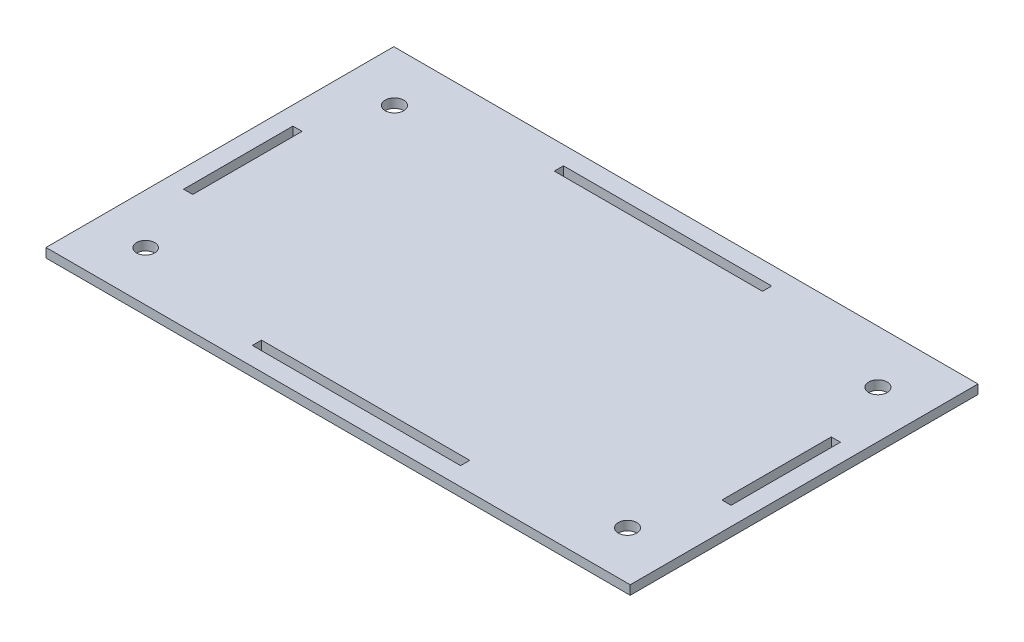
ISO-10303-21;
HEADER;
FILE_DESCRIPTION(('STEP AP214'),'2;1');
FILE_NAME('part.step','',(''),(''),'','','');
FILE_SCHEMA(('AUTOMOTIVE_DESIGN { 1 0 10303 214 1 1 1 1 }'));
ENDSEC;
DATA;
#1=APPLICATION_CONTEXT('core data for automotive mechanical design processes');
#2=APPLICATION_PROTOCOL_DEFINITION('international standard','automotive_design',2000,#1);
#3=PRODUCT_CONTEXT('',#1,'mechanical');
#4=PRODUCT('Part','Part','',(#3));
#5=PRODUCT_RELATED_PRODUCT_CATEGORY('part','',(#4));
#6=PRODUCT_DEFINITION_FORMATION('','',#4);
#7=PRODUCT_DEFINITION_CONTEXT('part definition',#1,'design');
#8=PRODUCT_DEFINITION('design','',#6,#7);
#9=PRODUCT_DEFINITION_SHAPE('','',#8);
#10=(LENGTH_UNIT() NAMED_UNIT(*) SI_UNIT(.MILLI.,.METRE.));
#11=(NAMED_UNIT(*) PLANE_ANGLE_UNIT() SI_UNIT($,.RADIAN.));
#12=(NAMED_UNIT(*) SI_UNIT($,.STERADIAN.) SOLID_ANGLE_UNIT());
#13=UNCERTAINTY_MEASURE_WITH_UNIT(LENGTH_MEASURE(1.E-05),#10,'distance_accuracy_value','');
#14=(GEOMETRIC_REPRESENTATION_CONTEXT(3) GLOBAL_UNCERTAINTY_ASSIGNED_CONTEXT((#13)) GLOBAL_UNIT_ASSIGNED_CONTEXT((#10,
#11,#12)) REPRESENTATION_CONTEXT('',''));
#15=CARTESIAN_POINT('',(0.,0.,0.));
#16=DIRECTION('',(0.,0.,1.));
#17=DIRECTION('',(1.,0.,0.));
#18=AXIS2_PLACEMENT_3D('',#15,#16,#17);
#19=CARTESIAN_POINT('',(0.,2.,0.));
#20=DIRECTION('',(0.,1.,0.));
#21=DIRECTION('',(0.,0.,1.));
#22=AXIS2_PLACEMENT_3D('',#19,#20,#21);
#23=PLANE('',#22);
#24=CARTESIAN_POINT('',(3.69534668895955,2.,-3.58517685274402));
#25=DIRECTION('',(0.,1.,0.));
#26=DIRECTION('',(0.,0.,1.));
#27=AXIS2_PLACEMENT_3D('',#24,#25,#26);
#28=CIRCLE('',#27,1.97543439169033);
#29=CARTESIAN_POINT('',(3.69534668895955,2.,-1.60974246105369));
#30=VERTEX_POINT('',#29);
#31=EDGE_CURVE('E642',#30,#30,#28,.T.);
#32=ORIENTED_EDGE('',*,*,#31,.F.);
#33=EDGE_LOOP('',(#32));
#34=FACE_BOUND('',#33,.T.);
#35=CARTESIAN_POINT('',(109.903070513536,2.,-57.085639350411));
#36=DIRECTION('',(0.,1.,0.));
#37=DIRECTION('',(0.,0.,1.));
#38=AXIS2_PLACEMENT_3D('',#35,#36,#37);
#39=CIRCLE('',#38,2.00578430429312);
#40=CARTESIAN_POINT('',(109.903070513536,2.,-55.0798550461179));
#41=VERTEX_POINT('',#40);
#42=EDGE_CURVE('E212',#41,#41,#39,.T.);
#43=ORIENTED_EDGE('',*,*,#42,.F.);
#44=EDGE_LOOP('',(#43));
#45=FACE_BOUND('',#44,.T.);
#46=DIRECTION('',(0.,0.,-1.));
#47=VECTOR('',#46,1.);
#48=CARTESIAN_POINT('',(120.186543169698,2.,7.22187722593417));
#49=LINE('',#48,#47);
#50=CARTESIAN_POINT('',(120.186543169698,2.,7.22187722593417));
#51=VERTEX_POINT('',#50);
#52=CARTESIAN_POINT('',(120.186543169698,2.,-68.6261227740658));
#53=VERTEX_POINT('',#52);
#54=EDGE_CURVE('E357',#51,#53,#49,.T.);
#55=ORIENTED_EDGE('',*,*,#54,.T.);
#56=DIRECTION('',(-1.,0.,0.));
#57=VECTOR('',#56,1.);
#58=CARTESIAN_POINT('',(120.186543169698,2.,-68.6261227740658));
#59=LINE('',#58,#57);
#60=CARTESIAN_POINT('',(-7.22345683030152,2.,-68.6261227740658));
#61=VERTEX_POINT('',#60);
#62=EDGE_CURVE('E361',#53,#61,#59,.T.);
#63=ORIENTED_EDGE('',*,*,#62,.T.);
#64=DIRECTION('',(0.,0.,1.));
#65=VECTOR('',#64,1.);
#66=CARTESIAN_POINT('',(-7.22345683030153,2.,7.22187722593419));
#67=LINE('',#66,#65);
#68=CARTESIAN_POINT('',(-7.22345683030153,2.,7.22187722593419));
#69=VERTEX_POINT('',#68);
#70=EDGE_CURVE('E365',#61,#69,#67,.T.);
#71=ORIENTED_EDGE('',*,*,#70,.T.);
#72=DIRECTION('',(1.,0.,0.));
#73=VECTOR('',#72,1.);
#74=CARTESIAN_POINT('',(120.186543169698,2.,7.22187722593417));
#75=LINE('',#74,#73);
#76=EDGE_CURVE('E368',#69,#51,#75,.T.);
#77=ORIENTED_EDGE('',*,*,#76,.T.);
#78=EDGE_LOOP('',(#55,#63,#71,#77));
#79=FACE_BOUND('',#78,.T.);
#80=DIRECTION('',(-1.,0.,0.));
#81=VECTOR('',#80,1.);
#82=CARTESIAN_POINT('',(-1.22345683030151,2.,-42.6261227740658));
#83=LINE('',#82,#81);
#84=CARTESIAN_POINT('',(-1.22345683030151,2.,-42.6261227740658));
#85=VERTEX_POINT('',#84);
#86=CARTESIAN_POINT('',(-3.22345683030152,2.,-42.6261227740658));
#87=VERTEX_POINT('',#86);
#88=EDGE_CURVE('E317',#85,#87,#83,.T.);
#89=ORIENTED_EDGE('',*,*,#88,.F.);
#90=DIRECTION('',(0.,0.,-1.));
#91=VECTOR('',#90,1.);
#92=CARTESIAN_POINT('',(-1.22345683030151,2.,-42.6261227740658));
#93=LINE('',#92,#91);
#94=CARTESIAN_POINT('',(-1.22345683030151,2.,-18.7781227740658));
#95=VERTEX_POINT('',#94);
#96=EDGE_CURVE('E314',#95,#85,#93,.T.);
#97=ORIENTED_EDGE('',*,*,#96,.F.);
#98=DIRECTION('',(1.,0.,0.));
#99=VECTOR('',#98,1.);
#100=CARTESIAN_POINT('',(-1.22345683030151,2.,-18.7781227740658));
#101=LINE('',#100,#99);
#102=CARTESIAN_POINT('',(-3.22345683030152,2.,-18.7781227740658));
#103=VERTEX_POINT('',#102);
#104=EDGE_CURVE('E325',#103,#95,#101,.T.);
#105=ORIENTED_EDGE('',*,*,#104,.F.);
#106=DIRECTION('',(0.,0.,1.));
#107=VECTOR('',#106,1.);
#108=CARTESIAN_POINT('',(-3.22345683030152,2.,-42.6261227740658));
#109=LINE('',#108,#107);
#110=EDGE_CURVE('E321',#87,#103,#109,.T.);
#111=ORIENTED_EDGE('',*,*,#110,.F.);
#112=EDGE_LOOP('',(#89,#97,#105,#111));
#113=FACE_BOUND('',#112,.T.);
#114=DIRECTION('',(1.,0.,0.));
#115=VECTOR('',#114,1.);
#116=CARTESIAN_POINT('',(33.7765431696985,2.,-62.6261227740658));
#117=LINE('',#116,#115);
#118=CARTESIAN_POINT('',(33.7765431696985,2.,-62.6261227740658));
#119=VERTEX_POINT('',#118);
#120=CARTESIAN_POINT('',(79.1865431696985,2.,-62.6261227740658));
#121=VERTEX_POINT('',#120);
#122=EDGE_CURVE('E274',#119,#121,#117,.T.);
#123=ORIENTED_EDGE('',*,*,#122,.F.);
#124=DIRECTION('',(0.,0.,1.));
#125=VECTOR('',#124,1.);
#126=CARTESIAN_POINT('',(33.7765431696985,2.,-62.6261227740658));
#127=LINE('',#126,#125);
#128=CARTESIAN_POINT('',(33.7765431696985,2.,-64.6261227740658));
#129=VERTEX_POINT('',#128);
#130=EDGE_CURVE('E271',#129,#119,#127,.T.);
#131=ORIENTED_EDGE('',*,*,#130,.F.);
#132=DIRECTION('',(-1.,0.,0.));
#133=VECTOR('',#132,1.);
#134=CARTESIAN_POINT('',(33.7765431696985,2.,-64.6261227740658));
#135=LINE('',#134,#133);
#136=CARTESIAN_POINT('',(79.1865431696985,2.,-64.6261227740658));
#137=VERTEX_POINT('',#136);
#138=EDGE_CURVE('E282',#137,#129,#135,.T.);
#139=ORIENTED_EDGE('',*,*,#138,.F.);
#140=DIRECTION('',(0.,0.,-1.));
#141=VECTOR('',#140,1.);
#142=CARTESIAN_POINT('',(79.1865431696985,2.,-62.6261227740658));
#143=LINE('',#142,#141);
#144=EDGE_CURVE('E278',#121,#137,#143,.T.);
#145=ORIENTED_EDGE('',*,*,#144,.F.);
#146=EDGE_LOOP('',(#123,#131,#139,#145));
#147=FACE_BOUND('',#146,.T.);
#148=DIRECTION('',(1.,0.,0.));
#149=VECTOR('',#148,1.);
#150=CARTESIAN_POINT('',(114.186543169698,2.,-18.7781227740658));
#151=LINE('',#150,#149);
#152=CARTESIAN_POINT('',(114.186543169698,2.,-18.7781227740658));
#153=VERTEX_POINT('',#152);
#154=CARTESIAN_POINT('',(116.186543169698,2.,-18.7781227740658));
#155=VERTEX_POINT('',#154);
#156=EDGE_CURVE('E231',#153,#155,#151,.T.);
#157=ORIENTED_EDGE('',*,*,#156,.F.);
#158=DIRECTION('',(0.,0.,1.));
#159=VECTOR('',#158,1.);
#160=CARTESIAN_POINT('',(114.186543169698,2.,-42.6261227740658));
#161=LINE('',#160,#159);
#162=CARTESIAN_POINT('',(114.186543169698,2.,-42.6261227740658));
#163=VERTEX_POINT('',#162);
#164=EDGE_CURVE('E228',#163,#153,#161,.T.);
#165=ORIENTED_EDGE('',*,*,#164,.F.);
#166=DIRECTION('',(-1.,0.,0.));
#167=VECTOR('',#166,1.);
#168=CARTESIAN_POINT('',(114.186543169698,2.,-42.6261227740658));
#169=LINE('',#168,#167);
#170=CARTESIAN_POINT('',(116.186543169698,2.,-42.6261227740658));
#171=VERTEX_POINT('',#170);
#172=EDGE_CURVE('E239',#171,#163,#169,.T.);
#173=ORIENTED_EDGE('',*,*,#172,.F.);
#174=DIRECTION('',(0.,0.,-1.));
#175=VECTOR('',#174,1.);
#176=CARTESIAN_POINT('',(116.186543169698,2.,-42.6261227740658));
#177=LINE('',#176,#175);
#178=EDGE_CURVE('E235',#155,#171,#177,.T.);
#179=ORIENTED_EDGE('',*,*,#178,.F.);
#180=EDGE_LOOP('',(#157,#165,#173,#179));
#181=FACE_BOUND('',#180,.T.);
#182=DIRECTION('',(-1.,0.,0.));
#183=VECTOR('',#182,1.);
#184=CARTESIAN_POINT('',(79.1865431696985,2.,1.22187722593417));
#185=LINE('',#184,#183);
#186=CARTESIAN_POINT('',(79.1865431696985,2.,1.22187722593417));
#187=VERTEX_POINT('',#186);
#188=CARTESIAN_POINT('',(33.7765431696985,2.,1.22187722593417));
#189=VERTEX_POINT('',#188);
#190=EDGE_CURVE('E186',#187,#189,#185,.T.);
#191=ORIENTED_EDGE('',*,*,#190,.F.);
#192=DIRECTION('',(0.,0.,-1.));
#193=VECTOR('',#192,1.);
#194=CARTESIAN_POINT('',(79.1865431696985,2.,1.22187722593417));
#195=LINE('',#194,#193);
#196=CARTESIAN_POINT('',(79.1865431696985,2.,3.22187722593417));
#197=VERTEX_POINT('',#196);
#198=EDGE_CURVE('E177',#197,#187,#195,.T.);
#199=ORIENTED_EDGE('',*,*,#198,.F.);
#200=DIRECTION('',(1.,0.,0.));
#201=VECTOR('',#200,1.);
#202=CARTESIAN_POINT('',(79.1865431696985,2.,3.22187722593417));
#203=LINE('',#202,#201);
#204=CARTESIAN_POINT('',(33.7765431696985,2.,3.22187722593417));
#205=VERTEX_POINT('',#204);
#206=EDGE_CURVE('E204',#205,#197,#203,.T.);
#207=ORIENTED_EDGE('',*,*,#206,.F.);
#208=DIRECTION('',(0.,0.,1.));
#209=VECTOR('',#208,1.);
#210=CARTESIAN_POINT('',(33.7765431696985,2.,1.22187722593417));
#211=LINE('',#210,#209);
#212=EDGE_CURVE('E200',#189,#205,#211,.T.);
#213=ORIENTED_EDGE('',*,*,#212,.F.);
#214=EDGE_LOOP('',(#191,#199,#207,#213));
#215=FACE_BOUND('',#214,.T.);
#216=CARTESIAN_POINT('',(109.140500171472,2.,-3.23821550651677));
#217=DIRECTION('',(0.,1.,0.));
#218=DIRECTION('',(0.,0.,1.));
#219=AXIS2_PLACEMENT_3D('',#216,#217,#218);
#220=CIRCLE('',#219,2.00764752498284);
#221=CARTESIAN_POINT('',(109.140500171472,2.,-1.23056798153392));
#222=VERTEX_POINT('',#221);
#223=EDGE_CURVE('E650',#222,#222,#220,.T.);
#224=ORIENTED_EDGE('',*,*,#223,.F.);
#225=EDGE_LOOP('',(#224));
#226=FACE_BOUND('',#225,.T.);
#227=CARTESIAN_POINT('',(3.94520992792013,2.,-57.6065574065732));
#228=DIRECTION('',(0.,1.,0.));
#229=DIRECTION('',(0.,0.,1.));
#230=AXIS2_PLACEMENT_3D('',#227,#228,#229);
#231=CIRCLE('',#230,2.02059865968082);
#232=CARTESIAN_POINT('',(3.94520992792013,2.,-55.5859587468924));
#233=VERTEX_POINT('',#232);
#234=EDGE_CURVE('E631',#233,#233,#231,.T.);
#235=ORIENTED_EDGE('',*,*,#234,.F.);
#236=EDGE_LOOP('',(#235));
#237=FACE_BOUND('',#236,.T.);
#238=ADVANCED_FACE('F39',(#34,#45,#79,#113,#147,#181,#215,#226,#237),#23,.T.);
#239=CARTESIAN_POINT('',(0.,0.,0.));
#240=DIRECTION('',(0.,1.,0.));
#241=DIRECTION('',(0.,0.,1.));
#242=AXIS2_PLACEMENT_3D('',#239,#240,#241);
#243=PLANE('',#242);
#244=DIRECTION('',(0.,0.,1.));
#245=VECTOR('',#244,1.);
#246=CARTESIAN_POINT('',(114.186543169698,0.,-42.6261227740658));
#247=LINE('',#246,#245);
#248=CARTESIAN_POINT('',(114.186543169698,0.,-42.6261227740658));
#249=VERTEX_POINT('',#248);
#250=CARTESIAN_POINT('',(114.186543169698,0.,-18.7781227740658));
#251=VERTEX_POINT('',#250);
#252=EDGE_CURVE('E195',#249,#251,#247,.T.);
#253=ORIENTED_EDGE('',*,*,#252,.T.);
#254=DIRECTION('',(1.,0.,0.));
#255=VECTOR('',#254,1.);
#256=CARTESIAN_POINT('',(114.186543169698,0.,-18.7781227740658));
#257=LINE('',#256,#255);
#258=CARTESIAN_POINT('',(116.186543169698,0.,-18.7781227740658));
#259=VERTEX_POINT('',#258);
#260=EDGE_CURVE('E246',#251,#259,#257,.T.);
#261=ORIENTED_EDGE('',*,*,#260,.T.);
#262=DIRECTION('',(0.,0.,-1.));
#263=VECTOR('',#262,1.);
#264=CARTESIAN_POINT('',(116.186543169698,0.,-42.6261227740658));
#265=LINE('',#264,#263);
#266=CARTESIAN_POINT('',(116.186543169698,0.,-42.6261227740658));
#267=VERTEX_POINT('',#266);
#268=EDGE_CURVE('E250',#259,#267,#265,.T.);
#269=ORIENTED_EDGE('',*,*,#268,.T.);
#270=DIRECTION('',(-1.,0.,0.));
#271=VECTOR('',#270,1.);
#272=CARTESIAN_POINT('',(114.186543169698,0.,-42.6261227740658));
#273=LINE('',#272,#271);
#274=EDGE_CURVE('E232',#267,#249,#273,.T.);
#275=ORIENTED_EDGE('',*,*,#274,.T.);
#276=EDGE_LOOP('',(#253,#261,#269,#275));
#277=FACE_BOUND('',#276,.T.);
#278=DIRECTION('',(0.,0.,-1.));
#279=VECTOR('',#278,1.);
#280=CARTESIAN_POINT('',(-1.22345683030151,0.,-42.6261227740658));
#281=LINE('',#280,#279);
#282=CARTESIAN_POINT('',(-1.22345683030151,0.,-18.7781227740658));
#283=VERTEX_POINT('',#282);
#284=CARTESIAN_POINT('',(-1.22345683030151,0.,-42.6261227740658));
#285=VERTEX_POINT('',#284);
#286=EDGE_CURVE('E313',#283,#285,#281,.T.);
#287=ORIENTED_EDGE('',*,*,#286,.T.);
#288=DIRECTION('',(-1.,0.,0.));
#289=VECTOR('',#288,1.);
#290=CARTESIAN_POINT('',(-1.22345683030151,0.,-42.6261227740658));
#291=LINE('',#290,#289);
#292=CARTESIAN_POINT('',(-3.22345683030152,0.,-42.6261227740658));
#293=VERTEX_POINT('',#292);
#294=EDGE_CURVE('E332',#285,#293,#291,.T.);
#295=ORIENTED_EDGE('',*,*,#294,.T.);
#296=DIRECTION('',(0.,0.,1.));
#297=VECTOR('',#296,1.);
#298=CARTESIAN_POINT('',(-3.22345683030152,0.,-42.6261227740658));
#299=LINE('',#298,#297);
#300=CARTESIAN_POINT('',(-3.22345683030152,0.,-18.7781227740658));
#301=VERTEX_POINT('',#300);
#302=EDGE_CURVE('E336',#293,#301,#299,.T.);
#303=ORIENTED_EDGE('',*,*,#302,.T.);
#304=DIRECTION('',(1.,0.,0.));
#305=VECTOR('',#304,1.);
#306=CARTESIAN_POINT('',(-1.22345683030151,0.,-18.7781227740658));
#307=LINE('',#306,#305);
#308=EDGE_CURVE('E318',#301,#283,#307,.T.);
#309=ORIENTED_EDGE('',*,*,#308,.T.);
#310=EDGE_LOOP('',(#287,#295,#303,#309));
#311=FACE_BOUND('',#310,.T.);
#312=DIRECTION('',(0.,0.,-1.));
#313=VECTOR('',#312,1.);
#314=CARTESIAN_POINT('',(120.186543169698,0.,7.22187722593417));
#315=LINE('',#314,#313);
#316=CARTESIAN_POINT('',(120.186543169698,0.,7.22187722593417));
#317=VERTEX_POINT('',#316);
#318=CARTESIAN_POINT('',(120.186543169698,0.,-68.6261227740658));
#319=VERTEX_POINT('',#318);
#320=EDGE_CURVE('E356',#317,#319,#315,.T.);
#321=ORIENTED_EDGE('',*,*,#320,.F.);
#322=DIRECTION('',(1.,0.,0.));
#323=VECTOR('',#322,1.);
#324=CARTESIAN_POINT('',(120.186543169698,0.,7.22187722593417));
#325=LINE('',#324,#323);
#326=CARTESIAN_POINT('',(-7.22345683030153,0.,7.22187722593419));
#327=VERTEX_POINT('',#326);
#328=EDGE_CURVE('E362',#327,#317,#325,.T.);
#329=ORIENTED_EDGE('',*,*,#328,.F.);
#330=DIRECTION('',(0.,0.,1.));
#331=VECTOR('',#330,1.);
#332=CARTESIAN_POINT('',(-7.22345683030153,0.,7.22187722593419));
#333=LINE('',#332,#331);
#334=CARTESIAN_POINT('',(-7.22345683030152,0.,-68.6261227740658));
#335=VERTEX_POINT('',#334);
#336=EDGE_CURVE('E378',#335,#327,#333,.T.);
#337=ORIENTED_EDGE('',*,*,#336,.F.);
#338=DIRECTION('',(-1.,0.,0.));
#339=VECTOR('',#338,1.);
#340=CARTESIAN_POINT('',(120.186543169698,0.,-68.6261227740658));
#341=LINE('',#340,#339);
#342=EDGE_CURVE('E375',#319,#335,#341,.T.);
#343=ORIENTED_EDGE('',*,*,#342,.F.);
#344=EDGE_LOOP('',(#321,#329,#337,#343));
#345=FACE_BOUND('',#344,.T.);
#346=DIRECTION('',(0.,0.,1.));
#347=VECTOR('',#346,1.);
#348=CARTESIAN_POINT('',(33.7765431696985,0.,-62.6261227740658));
#349=LINE('',#348,#347);
#350=CARTESIAN_POINT('',(33.7765431696985,0.,-64.6261227740658));
#351=VERTEX_POINT('',#350);
#352=CARTESIAN_POINT('',(33.7765431696985,0.,-62.6261227740658));
#353=VERTEX_POINT('',#352);
#354=EDGE_CURVE('E270',#351,#353,#349,.T.);
#355=ORIENTED_EDGE('',*,*,#354,.T.);
#356=DIRECTION('',(1.,0.,0.));
#357=VECTOR('',#356,1.);
#358=CARTESIAN_POINT('',(33.7765431696985,0.,-62.6261227740658));
#359=LINE('',#358,#357);
#360=CARTESIAN_POINT('',(79.1865431696985,0.,-62.6261227740658));
#361=VERTEX_POINT('',#360);
#362=EDGE_CURVE('E289',#353,#361,#359,.T.);
#363=ORIENTED_EDGE('',*,*,#362,.T.);
#364=DIRECTION('',(0.,0.,-1.));
#365=VECTOR('',#364,1.);
#366=CARTESIAN_POINT('',(79.1865431696985,0.,-62.6261227740658));
#367=LINE('',#366,#365);
#368=CARTESIAN_POINT('',(79.1865431696985,0.,-64.6261227740658));
#369=VERTEX_POINT('',#368);
#370=EDGE_CURVE('E293',#361,#369,#367,.T.);
#371=ORIENTED_EDGE('',*,*,#370,.T.);
#372=DIRECTION('',(-1.,0.,0.));
#373=VECTOR('',#372,1.);
#374=CARTESIAN_POINT('',(33.7765431696985,0.,-64.6261227740658));
#375=LINE('',#374,#373);
#376=EDGE_CURVE('E275',#369,#351,#375,.T.);
#377=ORIENTED_EDGE('',*,*,#376,.T.);
#378=EDGE_LOOP('',(#355,#363,#371,#377));
#379=FACE_BOUND('',#378,.T.);
#380=DIRECTION('',(0.,0.,-1.));
#381=VECTOR('',#380,1.);
#382=CARTESIAN_POINT('',(79.1865431696985,0.,1.22187722593417));
#383=LINE('',#382,#381);
#384=CARTESIAN_POINT('',(79.1865431696985,0.,3.22187722593417));
#385=VERTEX_POINT('',#384);
#386=CARTESIAN_POINT('',(79.1865431696985,0.,1.22187722593417));
#387=VERTEX_POINT('',#386);
#388=EDGE_CURVE('E63',#385,#387,#383,.T.);
#389=ORIENTED_EDGE('',*,*,#388,.T.);
#390=DIRECTION('',(-1.,0.,0.));
#391=VECTOR('',#390,1.);
#392=CARTESIAN_POINT('',(79.1865431696985,0.,1.22187722593417));
#393=LINE('',#392,#391);
#394=CARTESIAN_POINT('',(33.7765431696985,0.,1.22187722593417));
#395=VERTEX_POINT('',#394);
#396=EDGE_CURVE('E193',#387,#395,#393,.T.);
#397=ORIENTED_EDGE('',*,*,#396,.T.);
#398=DIRECTION('',(0.,0.,1.));
#399=VECTOR('',#398,1.);
#400=CARTESIAN_POINT('',(33.7765431696985,0.,1.22187722593417));
#401=LINE('',#400,#399);
#402=CARTESIAN_POINT('',(33.7765431696985,0.,3.22187722593417));
#403=VERTEX_POINT('',#402);
#404=EDGE_CURVE('E215',#395,#403,#401,.T.);
#405=ORIENTED_EDGE('',*,*,#404,.T.);
#406=DIRECTION('',(1.,0.,0.));
#407=VECTOR('',#406,1.);
#408=CARTESIAN_POINT('',(79.1865431696985,0.,3.22187722593417));
#409=LINE('',#408,#407);
#410=EDGE_CURVE('E187',#403,#385,#409,.T.);
#411=ORIENTED_EDGE('',*,*,#410,.T.);
#412=EDGE_LOOP('',(#389,#397,#405,#411));
#413=FACE_BOUND('',#412,.T.);
#414=CARTESIAN_POINT('',(109.903070513536,0.,-57.085639350411));
#415=DIRECTION('',(0.,1.,0.));
#416=DIRECTION('',(0.,0.,1.));
#417=AXIS2_PLACEMENT_3D('',#414,#415,#416);
#418=CIRCLE('',#417,2.00578430429312);
#419=CARTESIAN_POINT('',(109.903070513536,0.,-55.0798550461179));
#420=VERTEX_POINT('',#419);
#421=EDGE_CURVE('E654',#420,#420,#418,.T.);
#422=ORIENTED_EDGE('',*,*,#421,.T.);
#423=EDGE_LOOP('',(#422));
#424=FACE_BOUND('',#423,.T.);
#425=CARTESIAN_POINT('',(109.140500171472,0.,-3.23821550651677));
#426=DIRECTION('',(0.,1.,0.));
#427=DIRECTION('',(0.,0.,1.));
#428=AXIS2_PLACEMENT_3D('',#425,#426,#427);
#429=CIRCLE('',#428,2.00764752498284);
#430=CARTESIAN_POINT('',(109.140500171472,0.,-1.23056798153392));
#431=VERTEX_POINT('',#430);
#432=EDGE_CURVE('E646',#431,#431,#429,.T.);
#433=ORIENTED_EDGE('',*,*,#432,.T.);
#434=EDGE_LOOP('',(#433));
#435=FACE_BOUND('',#434,.T.);
#436=CARTESIAN_POINT('',(3.69534668895955,0.,-3.58517685274402));
#437=DIRECTION('',(0.,1.,0.));
#438=DIRECTION('',(0.,0.,1.));
#439=AXIS2_PLACEMENT_3D('',#436,#437,#438);
#440=CIRCLE('',#439,1.97543439169033);
#441=CARTESIAN_POINT('',(3.69534668895955,0.,-1.60974246105369));
#442=VERTEX_POINT('',#441);
#443=EDGE_CURVE('E639',#442,#442,#440,.T.);
#444=ORIENTED_EDGE('',*,*,#443,.T.);
#445=EDGE_LOOP('',(#444));
#446=FACE_BOUND('',#445,.T.);
#447=CARTESIAN_POINT('',(3.94520992792013,0.,-57.6065574065732));
#448=DIRECTION('',(0.,1.,0.));
#449=DIRECTION('',(0.,0.,1.));
#450=AXIS2_PLACEMENT_3D('',#447,#448,#449);
#451=CIRCLE('',#450,2.02059865968082);
#452=CARTESIAN_POINT('',(3.94520992792013,0.,-55.5859587468924));
#453=VERTEX_POINT('',#452);
#454=EDGE_CURVE('E634',#453,#453,#451,.T.);
#455=ORIENTED_EDGE('',*,*,#454,.T.);
#456=EDGE_LOOP('',(#455));
#457=FACE_BOUND('',#456,.T.);
#458=ADVANCED_FACE('F401',(#277,#311,#345,#379,#413,#424,#435,#446,#457),#243,.F.);
#459=CARTESIAN_POINT('',(120.186543169698,2.,7.22187722593417));
#460=DIRECTION('',(-1.,0.,0.));
#461=DIRECTION('',(0.,0.,1.));
#462=AXIS2_PLACEMENT_3D('',#459,#460,#461);
#463=PLANE('',#462);
#464=ORIENTED_EDGE('',*,*,#320,.T.);
#465=DIRECTION('',(0.,-1.,0.));
#466=VECTOR('',#465,1.);
#467=CARTESIAN_POINT('',(120.186543169698,2.,-68.6261227740658));
#468=LINE('',#467,#466);
#469=EDGE_CURVE('E11',#53,#319,#468,.T.);
#470=ORIENTED_EDGE('',*,*,#469,.F.);
#471=ORIENTED_EDGE('',*,*,#54,.F.);
#472=DIRECTION('',(0.,-1.,0.));
#473=VECTOR('',#472,1.);
#474=CARTESIAN_POINT('',(120.186543169698,2.,7.22187722593417));
#475=LINE('',#474,#473);
#476=EDGE_CURVE('E371',#51,#317,#475,.T.);
#477=ORIENTED_EDGE('',*,*,#476,.T.);
#478=EDGE_LOOP('',(#464,#470,#471,#477));
#479=FACE_BOUND('',#478,.T.);
#480=ADVANCED_FACE('F41',(#479),#463,.F.);
#481=CARTESIAN_POINT('',(120.186543169698,2.,-68.6261227740658));
#482=DIRECTION('',(0.,0.,1.));
#483=DIRECTION('',(1.,0.,0.));
#484=AXIS2_PLACEMENT_3D('',#481,#482,#483);
#485=PLANE('',#484);
#486=ORIENTED_EDGE('',*,*,#342,.T.);
#487=DIRECTION('',(0.,-1.,0.));
#488=VECTOR('',#487,1.);
#489=CARTESIAN_POINT('',(-7.22345683030152,2.,-68.6261227740658));
#490=LINE('',#489,#488);
#491=EDGE_CURVE('E48',#61,#335,#490,.T.);
#492=ORIENTED_EDGE('',*,*,#491,.F.);
#493=ORIENTED_EDGE('',*,*,#62,.F.);
#494=ORIENTED_EDGE('',*,*,#469,.T.);
#495=EDGE_LOOP('',(#486,#492,#493,#494));
#496=FACE_BOUND('',#495,.T.);
#497=ADVANCED_FACE('F412',(#496),#485,.F.);
#498=CARTESIAN_POINT('',(-7.22345683030153,2.,7.22187722593419));
#499=DIRECTION('',(1.,0.,0.));
#500=DIRECTION('',(0.,0.,-1.));
#501=AXIS2_PLACEMENT_3D('',#498,#499,#500);
#502=PLANE('',#501);
#503=ORIENTED_EDGE('',*,*,#336,.T.);
#504=DIRECTION('',(0.,-1.,0.));
#505=VECTOR('',#504,1.);
#506=CARTESIAN_POINT('',(-7.22345683030153,2.,7.22187722593419));
#507=LINE('',#506,#505);
#508=EDGE_CURVE('E386',#69,#327,#507,.T.);
#509=ORIENTED_EDGE('',*,*,#508,.F.);
#510=ORIENTED_EDGE('',*,*,#70,.F.);
#511=ORIENTED_EDGE('',*,*,#491,.T.);
#512=EDGE_LOOP('',(#503,#509,#510,#511));
#513=FACE_BOUND('',#512,.T.);
#514=ADVANCED_FACE('F395',(#513),#502,.F.);
#515=CARTESIAN_POINT('',(120.186543169698,2.,7.22187722593417));
#516=DIRECTION('',(0.,0.,-1.));
#517=DIRECTION('',(-1.,0.,0.));
#518=AXIS2_PLACEMENT_3D('',#515,#516,#517);
#519=PLANE('',#518);
#520=ORIENTED_EDGE('',*,*,#328,.T.);
#521=ORIENTED_EDGE('',*,*,#476,.F.);
#522=ORIENTED_EDGE('',*,*,#76,.F.);
#523=ORIENTED_EDGE('',*,*,#508,.T.);
#524=EDGE_LOOP('',(#520,#521,#522,#523));
#525=FACE_BOUND('',#524,.T.);
#526=ADVANCED_FACE('F405',(#525),#519,.F.);
#527=CARTESIAN_POINT('',(-1.22345683030151,2.,-42.6261227740658));
#528=DIRECTION('',(-1.,0.,0.));
#529=DIRECTION('',(0.,0.,1.));
#530=AXIS2_PLACEMENT_3D('',#527,#528,#529);
#531=PLANE('',#530);
#532=ORIENTED_EDGE('',*,*,#286,.F.);
#533=DIRECTION('',(0.,-1.,0.));
#534=VECTOR('',#533,1.);
#535=CARTESIAN_POINT('',(-1.22345683030151,2.,-18.7781227740658));
#536=LINE('',#535,#534);
#537=EDGE_CURVE('E328',#95,#283,#536,.T.);
#538=ORIENTED_EDGE('',*,*,#537,.F.);
#539=ORIENTED_EDGE('',*,*,#96,.T.);
#540=DIRECTION('',(0.,-1.,0.));
#541=VECTOR('',#540,1.);
#542=CARTESIAN_POINT('',(-1.22345683030151,2.,-42.6261227740658));
#543=LINE('',#542,#541);
#544=EDGE_CURVE('E352',#85,#285,#543,.T.);
#545=ORIENTED_EDGE('',*,*,#544,.T.);
#546=EDGE_LOOP('',(#532,#538,#539,#545));
#547=FACE_BOUND('',#546,.T.);
#548=ADVANCED_FACE('F430',(#547),#531,.T.);
#549=CARTESIAN_POINT('',(-1.22345683030151,2.,-42.6261227740658));
#550=DIRECTION('',(0.,0.,1.));
#551=DIRECTION('',(1.,0.,0.));
#552=AXIS2_PLACEMENT_3D('',#549,#550,#551);
#553=PLANE('',#552);
#554=ORIENTED_EDGE('',*,*,#294,.F.);
#555=ORIENTED_EDGE('',*,*,#544,.F.);
#556=ORIENTED_EDGE('',*,*,#88,.T.);
#557=DIRECTION('',(0.,-1.,0.));
#558=VECTOR('',#557,1.);
#559=CARTESIAN_POINT('',(-3.22345683030152,2.,-42.6261227740658));
#560=LINE('',#559,#558);
#561=EDGE_CURVE('E349',#87,#293,#560,.T.);
#562=ORIENTED_EDGE('',*,*,#561,.T.);
#563=EDGE_LOOP('',(#554,#555,#556,#562));
#564=FACE_BOUND('',#563,.T.);
#565=ADVANCED_FACE('F437',(#564),#553,.T.);
#566=CARTESIAN_POINT('',(-3.22345683030152,2.,-42.6261227740658));
#567=DIRECTION('',(1.,0.,0.));
#568=DIRECTION('',(0.,0.,-1.));
#569=AXIS2_PLACEMENT_3D('',#566,#567,#568);
#570=PLANE('',#569);
#571=ORIENTED_EDGE('',*,*,#302,.F.);
#572=ORIENTED_EDGE('',*,*,#561,.F.);
#573=ORIENTED_EDGE('',*,*,#110,.T.);
#574=DIRECTION('',(0.,-1.,0.));
#575=VECTOR('',#574,1.);
#576=CARTESIAN_POINT('',(-3.22345683030152,2.,-18.7781227740658));
#577=LINE('',#576,#575);
#578=EDGE_CURVE('E346',#103,#301,#577,.T.);
#579=ORIENTED_EDGE('',*,*,#578,.T.);
#580=EDGE_LOOP('',(#571,#572,#573,#579));
#581=FACE_BOUND('',#580,.T.);
#582=ADVANCED_FACE('F442',(#581),#570,.T.);
#583=CARTESIAN_POINT('',(-1.22345683030151,2.,-18.7781227740658));
#584=DIRECTION('',(0.,0.,-1.));
#585=DIRECTION('',(-1.,0.,0.));
#586=AXIS2_PLACEMENT_3D('',#583,#584,#585);
#587=PLANE('',#586);
#588=ORIENTED_EDGE('',*,*,#308,.F.);
#589=ORIENTED_EDGE('',*,*,#578,.F.);
#590=ORIENTED_EDGE('',*,*,#104,.T.);
#591=ORIENTED_EDGE('',*,*,#537,.T.);
#592=EDGE_LOOP('',(#588,#589,#590,#591));
#593=FACE_BOUND('',#592,.T.);
#594=ADVANCED_FACE('F450',(#593),#587,.T.);
#595=CARTESIAN_POINT('',(33.7765431696985,2.,-62.6261227740658));
#596=DIRECTION('',(1.,0.,0.));
#597=DIRECTION('',(0.,0.,-1.));
#598=AXIS2_PLACEMENT_3D('',#595,#596,#597);
#599=PLANE('',#598);
#600=ORIENTED_EDGE('',*,*,#354,.F.);
#601=DIRECTION('',(0.,-1.,0.));
#602=VECTOR('',#601,1.);
#603=CARTESIAN_POINT('',(33.7765431696985,2.,-64.6261227740658));
#604=LINE('',#603,#602);
#605=EDGE_CURVE('E285',#129,#351,#604,.T.);
#606=ORIENTED_EDGE('',*,*,#605,.F.);
#607=ORIENTED_EDGE('',*,*,#130,.T.);
#608=DIRECTION('',(0.,-1.,0.));
#609=VECTOR('',#608,1.);
#610=CARTESIAN_POINT('',(33.7765431696985,2.,-62.6261227740658));
#611=LINE('',#610,#609);
#612=EDGE_CURVE('E309',#119,#353,#611,.T.);
#613=ORIENTED_EDGE('',*,*,#612,.T.);
#614=EDGE_LOOP('',(#600,#606,#607,#613));
#615=FACE_BOUND('',#614,.T.);
#616=ADVANCED_FACE('F504',(#615),#599,.T.);
#617=CARTESIAN_POINT('',(33.7765431696985,2.,-62.6261227740658));
#618=DIRECTION('',(0.,0.,-1.));
#619=DIRECTION('',(-1.,0.,0.));
#620=AXIS2_PLACEMENT_3D('',#617,#618,#619);
#621=PLANE('',#620);
#622=ORIENTED_EDGE('',*,*,#362,.F.);
#623=ORIENTED_EDGE('',*,*,#612,.F.);
#624=ORIENTED_EDGE('',*,*,#122,.T.);
#625=DIRECTION('',(0.,-1.,0.));
#626=VECTOR('',#625,1.);
#627=CARTESIAN_POINT('',(79.1865431696985,2.,-62.6261227740658));
#628=LINE('',#627,#626);
#629=EDGE_CURVE('E306',#121,#361,#628,.T.);
#630=ORIENTED_EDGE('',*,*,#629,.T.);
#631=EDGE_LOOP('',(#622,#623,#624,#630));
#632=FACE_BOUND('',#631,.T.);
#633=ADVANCED_FACE('F500',(#632),#621,.T.);
#634=CARTESIAN_POINT('',(79.1865431696985,2.,-62.6261227740658));
#635=DIRECTION('',(-1.,0.,0.));
#636=DIRECTION('',(0.,0.,1.));
#637=AXIS2_PLACEMENT_3D('',#634,#635,#636);
#638=PLANE('',#637);
#639=ORIENTED_EDGE('',*,*,#370,.F.);
#640=ORIENTED_EDGE('',*,*,#629,.F.);
#641=ORIENTED_EDGE('',*,*,#144,.T.);
#642=DIRECTION('',(0.,-1.,0.));
#643=VECTOR('',#642,1.);
#644=CARTESIAN_POINT('',(79.1865431696985,2.,-64.6261227740658));
#645=LINE('',#644,#643);
#646=EDGE_CURVE('E303',#137,#369,#645,.T.);
#647=ORIENTED_EDGE('',*,*,#646,.T.);
#648=EDGE_LOOP('',(#639,#640,#641,#647));
#649=FACE_BOUND('',#648,.T.);
#650=ADVANCED_FACE('F496',(#649),#638,.T.);
#651=CARTESIAN_POINT('',(33.7765431696985,2.,-64.6261227740658));
#652=DIRECTION('',(0.,0.,1.));
#653=DIRECTION('',(1.,0.,0.));
#654=AXIS2_PLACEMENT_3D('',#651,#652,#653);
#655=PLANE('',#654);
#656=ORIENTED_EDGE('',*,*,#376,.F.);
#657=ORIENTED_EDGE('',*,*,#646,.F.);
#658=ORIENTED_EDGE('',*,*,#138,.T.);
#659=ORIENTED_EDGE('',*,*,#605,.T.);
#660=EDGE_LOOP('',(#656,#657,#658,#659));
#661=FACE_BOUND('',#660,.T.);
#662=ADVANCED_FACE('F493',(#661),#655,.T.);
#663=CARTESIAN_POINT('',(114.186543169698,2.,-42.6261227740658));
#664=DIRECTION('',(1.,0.,0.));
#665=DIRECTION('',(0.,0.,-1.));
#666=AXIS2_PLACEMENT_3D('',#663,#664,#665);
#667=PLANE('',#666);
#668=ORIENTED_EDGE('',*,*,#252,.F.);
#669=DIRECTION('',(0.,-1.,0.));
#670=VECTOR('',#669,1.);
#671=CARTESIAN_POINT('',(114.186543169698,2.,-42.6261227740658));
#672=LINE('',#671,#670);
#673=EDGE_CURVE('E242',#163,#249,#672,.T.);
#674=ORIENTED_EDGE('',*,*,#673,.F.);
#675=ORIENTED_EDGE('',*,*,#164,.T.);
#676=DIRECTION('',(0.,-1.,0.));
#677=VECTOR('',#676,1.);
#678=CARTESIAN_POINT('',(114.186543169698,2.,-18.7781227740658));
#679=LINE('',#678,#677);
#680=EDGE_CURVE('E266',#153,#251,#679,.T.);
#681=ORIENTED_EDGE('',*,*,#680,.T.);
#682=EDGE_LOOP('',(#668,#674,#675,#681));
#683=FACE_BOUND('',#682,.T.);
#684=ADVANCED_FACE('F475',(#683),#667,.T.);
#685=CARTESIAN_POINT('',(114.186543169698,2.,-18.7781227740658));
#686=DIRECTION('',(0.,0.,-1.));
#687=DIRECTION('',(-1.,0.,0.));
#688=AXIS2_PLACEMENT_3D('',#685,#686,#687);
#689=PLANE('',#688);
#690=ORIENTED_EDGE('',*,*,#260,.F.);
#691=ORIENTED_EDGE('',*,*,#680,.F.);
#692=ORIENTED_EDGE('',*,*,#156,.T.);
#693=DIRECTION('',(0.,-1.,0.));
#694=VECTOR('',#693,1.);
#695=CARTESIAN_POINT('',(116.186543169698,2.,-18.7781227740658));
#696=LINE('',#695,#694);
#697=EDGE_CURVE('E263',#155,#259,#696,.T.);
#698=ORIENTED_EDGE('',*,*,#697,.T.);
#699=EDGE_LOOP('',(#690,#691,#692,#698));
#700=FACE_BOUND('',#699,.T.);
#701=ADVANCED_FACE('F469',(#700),#689,.T.);
#702=CARTESIAN_POINT('',(116.186543169698,2.,-42.6261227740658));
#703=DIRECTION('',(-1.,0.,0.));
#704=DIRECTION('',(0.,0.,1.));
#705=AXIS2_PLACEMENT_3D('',#702,#703,#704);
#706=PLANE('',#705);
#707=ORIENTED_EDGE('',*,*,#268,.F.);
#708=ORIENTED_EDGE('',*,*,#697,.F.);
#709=ORIENTED_EDGE('',*,*,#178,.T.);
#710=DIRECTION('',(0.,-1.,0.));
#711=VECTOR('',#710,1.);
#712=CARTESIAN_POINT('',(116.186543169698,2.,-42.6261227740658));
#713=LINE('',#712,#711);
#714=EDGE_CURVE('E260',#171,#267,#713,.T.);
#715=ORIENTED_EDGE('',*,*,#714,.T.);
#716=EDGE_LOOP('',(#707,#708,#709,#715));
#717=FACE_BOUND('',#716,.T.);
#718=ADVANCED_FACE('F472',(#717),#706,.T.);
#719=CARTESIAN_POINT('',(114.186543169698,2.,-42.6261227740658));
#720=DIRECTION('',(0.,0.,1.));
#721=DIRECTION('',(1.,0.,0.));
#722=AXIS2_PLACEMENT_3D('',#719,#720,#721);
#723=PLANE('',#722);
#724=ORIENTED_EDGE('',*,*,#274,.F.);
#725=ORIENTED_EDGE('',*,*,#714,.F.);
#726=ORIENTED_EDGE('',*,*,#172,.T.);
#727=ORIENTED_EDGE('',*,*,#673,.T.);
#728=EDGE_LOOP('',(#724,#725,#726,#727));
#729=FACE_BOUND('',#728,.T.);
#730=ADVANCED_FACE('F478',(#729),#723,.T.);
#731=CARTESIAN_POINT('',(79.1865431696985,2.,1.22187722593417));
#732=DIRECTION('',(-1.,0.,0.));
#733=DIRECTION('',(0.,0.,1.));
#734=AXIS2_PLACEMENT_3D('',#731,#732,#733);
#735=PLANE('',#734);
#736=ORIENTED_EDGE('',*,*,#388,.F.);
#737=DIRECTION('',(0.,-1.,0.));
#738=VECTOR('',#737,1.);
#739=CARTESIAN_POINT('',(79.1865431696985,2.,3.22187722593417));
#740=LINE('',#739,#738);
#741=EDGE_CURVE('E181',#197,#385,#740,.T.);
#742=ORIENTED_EDGE('',*,*,#741,.F.);
#743=ORIENTED_EDGE('',*,*,#198,.T.);
#744=DIRECTION('',(0.,-1.,0.));
#745=VECTOR('',#744,1.);
#746=CARTESIAN_POINT('',(79.1865431696985,2.,1.22187722593417));
#747=LINE('',#746,#745);
#748=EDGE_CURVE('E180',#187,#387,#747,.T.);
#749=ORIENTED_EDGE('',*,*,#748,.T.);
#750=EDGE_LOOP('',(#736,#742,#743,#749));
#751=FACE_BOUND('',#750,.T.);
#752=ADVANCED_FACE('F179',(#751),#735,.T.);
#753=CARTESIAN_POINT('',(79.1865431696985,2.,1.22187722593417));
#754=DIRECTION('',(0.,0.,1.));
#755=DIRECTION('',(1.,0.,0.));
#756=AXIS2_PLACEMENT_3D('',#753,#754,#755);
#757=PLANE('',#756);
#758=ORIENTED_EDGE('',*,*,#396,.F.);
#759=ORIENTED_EDGE('',*,*,#748,.F.);
#760=ORIENTED_EDGE('',*,*,#190,.T.);
#761=DIRECTION('',(0.,-1.,0.));
#762=VECTOR('',#761,1.);
#763=CARTESIAN_POINT('',(33.7765431696985,2.,1.22187722593417));
#764=LINE('',#763,#762);
#765=EDGE_CURVE('E196',#189,#395,#764,.T.);
#766=ORIENTED_EDGE('',*,*,#765,.T.);
#767=EDGE_LOOP('',(#758,#759,#760,#766));
#768=FACE_BOUND('',#767,.T.);
#769=ADVANCED_FACE('F190',(#768),#757,.T.);
#770=CARTESIAN_POINT('',(33.7765431696985,2.,1.22187722593417));
#771=DIRECTION('',(1.,0.,0.));
#772=DIRECTION('',(0.,0.,-1.));
#773=AXIS2_PLACEMENT_3D('',#770,#771,#772);
#774=PLANE('',#773);
#775=ORIENTED_EDGE('',*,*,#404,.F.);
#776=ORIENTED_EDGE('',*,*,#765,.F.);
#777=ORIENTED_EDGE('',*,*,#212,.T.);
#778=DIRECTION('',(0.,-1.,0.));
#779=VECTOR('',#778,1.);
#780=CARTESIAN_POINT('',(33.7765431696985,2.,3.22187722593417));
#781=LINE('',#780,#779);
#782=EDGE_CURVE('E55',#205,#403,#781,.T.);
#783=ORIENTED_EDGE('',*,*,#782,.T.);
#784=EDGE_LOOP('',(#775,#776,#777,#783));
#785=FACE_BOUND('',#784,.T.);
#786=ADVANCED_FACE('F567',(#785),#774,.T.);
#787=CARTESIAN_POINT('',(79.1865431696985,2.,3.22187722593417));
#788=DIRECTION('',(0.,0.,-1.));
#789=DIRECTION('',(-1.,0.,0.));
#790=AXIS2_PLACEMENT_3D('',#787,#788,#789);
#791=PLANE('',#790);
#792=ORIENTED_EDGE('',*,*,#410,.F.);
#793=ORIENTED_EDGE('',*,*,#782,.F.);
#794=ORIENTED_EDGE('',*,*,#206,.T.);
#795=ORIENTED_EDGE('',*,*,#741,.T.);
#796=EDGE_LOOP('',(#792,#793,#794,#795));
#797=FACE_BOUND('',#796,.T.);
#798=ADVANCED_FACE('F575',(#797),#791,.T.);
#799=CARTESIAN_POINT('',(109.903070513536,2.,-57.085639350411));
#800=DIRECTION('',(0.,-1.,0.));
#801=DIRECTION('',(0.,0.,-1.));
#802=AXIS2_PLACEMENT_3D('',#799,#800,#801);
#803=CYLINDRICAL_SURFACE('',#802,2.00578430429312);
#804=ORIENTED_EDGE('',*,*,#42,.T.);
#805=EDGE_LOOP('',(#804));
#806=FACE_BOUND('',#805,.T.);
#807=ORIENTED_EDGE('',*,*,#421,.F.);
#808=EDGE_LOOP('',(#807));
#809=FACE_BOUND('',#808,.T.);
#810=ADVANCED_FACE('F585',(#806,#809),#803,.F.);
#811=CARTESIAN_POINT('',(109.140500171472,2.,-3.23821550651677));
#812=DIRECTION('',(0.,-1.,0.));
#813=DIRECTION('',(0.,0.,-1.));
#814=AXIS2_PLACEMENT_3D('',#811,#812,#813);
#815=CYLINDRICAL_SURFACE('',#814,2.00764752498284);
#816=ORIENTED_EDGE('',*,*,#223,.T.);
#817=EDGE_LOOP('',(#816));
#818=FACE_BOUND('',#817,.T.);
#819=ORIENTED_EDGE('',*,*,#432,.F.);
#820=EDGE_LOOP('',(#819));
#821=FACE_BOUND('',#820,.T.);
#822=ADVANCED_FACE('F594',(#818,#821),#815,.F.);
#823=CARTESIAN_POINT('',(3.69534668895955,2.,-3.58517685274402));
#824=DIRECTION('',(0.,-1.,0.));
#825=DIRECTION('',(0.,0.,-1.));
#826=AXIS2_PLACEMENT_3D('',#823,#824,#825);
#827=CYLINDRICAL_SURFACE('',#826,1.97543439169033);
#828=ORIENTED_EDGE('',*,*,#31,.T.);
#829=EDGE_LOOP('',(#828));
#830=FACE_BOUND('',#829,.T.);
#831=ORIENTED_EDGE('',*,*,#443,.F.);
#832=EDGE_LOOP('',(#831));
#833=FACE_BOUND('',#832,.T.);
#834=ADVANCED_FACE('F604',(#830,#833),#827,.F.);
#835=CARTESIAN_POINT('',(3.94520992792013,2.,-57.6065574065732));
#836=DIRECTION('',(0.,-1.,0.));
#837=DIRECTION('',(0.,0.,-1.));
#838=AXIS2_PLACEMENT_3D('',#835,#836,#837);
#839=CYLINDRICAL_SURFACE('',#838,2.02059865968082);
#840=ORIENTED_EDGE('',*,*,#234,.T.);
#841=EDGE_LOOP('',(#840));
#842=FACE_BOUND('',#841,.T.);
#843=ORIENTED_EDGE('',*,*,#454,.F.);
#844=EDGE_LOOP('',(#843));
#845=FACE_BOUND('',#844,.T.);
#846=ADVANCED_FACE('F614',(#842,#845),#839,.F.);
#847=CLOSED_SHELL('',(#238,#458,#480,#497,#514,#526,#548,#565,#582,#594,#616,#633,#650,#662,
#684,#701,#718,#730,#752,#769,#786,#798,#810,#822,#834,#846));
#848=MANIFOLD_SOLID_BREP('B2',#847);
#849=ADVANCED_BREP_SHAPE_REPRESENTATION('',(#18,#848),#14);
#850=SHAPE_DEFINITION_REPRESENTATION(#9,#849);
ENDSEC;
END-ISO-10303-21;
